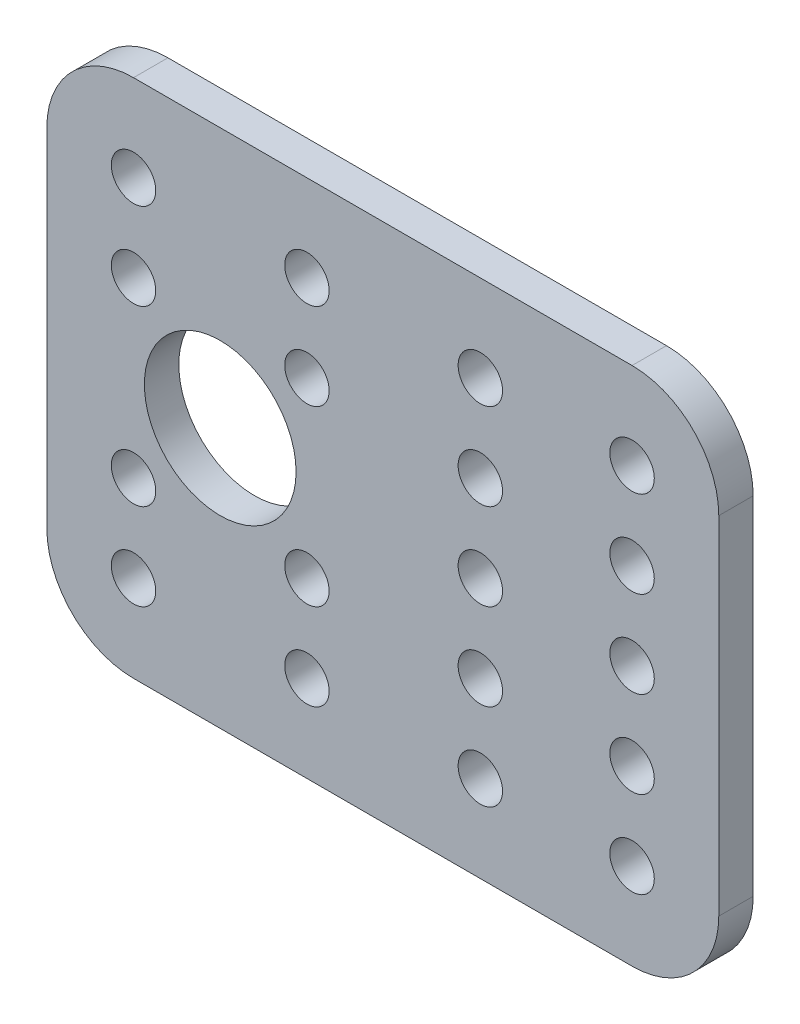
ISO-10303-21;
HEADER;
FILE_DESCRIPTION(('STEP AP214'),'2;1');
FILE_NAME('part.step','',(''),(''),'','','');
FILE_SCHEMA(('AUTOMOTIVE_DESIGN { 1 0 10303 214 1 1 1 1 }'));
ENDSEC;
DATA;
#1=APPLICATION_CONTEXT('core data for automotive mechanical design processes');
#2=APPLICATION_PROTOCOL_DEFINITION('international standard','automotive_design',2000,#1);
#3=PRODUCT_CONTEXT('',#1,'mechanical');
#4=PRODUCT('Part','Part','',(#3));
#5=PRODUCT_RELATED_PRODUCT_CATEGORY('part','',(#4));
#6=PRODUCT_DEFINITION_FORMATION('','',#4);
#7=PRODUCT_DEFINITION_CONTEXT('part definition',#1,'design');
#8=PRODUCT_DEFINITION('design','',#6,#7);
#9=PRODUCT_DEFINITION_SHAPE('','',#8);
#10=(LENGTH_UNIT() NAMED_UNIT(*) SI_UNIT(.MILLI.,.METRE.));
#11=(NAMED_UNIT(*) PLANE_ANGLE_UNIT() SI_UNIT($,.RADIAN.));
#12=(NAMED_UNIT(*) SI_UNIT($,.STERADIAN.) SOLID_ANGLE_UNIT());
#13=UNCERTAINTY_MEASURE_WITH_UNIT(LENGTH_MEASURE(1.E-05),#10,'distance_accuracy_value','');
#14=(GEOMETRIC_REPRESENTATION_CONTEXT(3) GLOBAL_UNCERTAINTY_ASSIGNED_CONTEXT((#13)) GLOBAL_UNIT_ASSIGNED_CONTEXT((#10,
#11,#12)) REPRESENTATION_CONTEXT('',''));
#15=CARTESIAN_POINT('',(0.,0.,0.));
#16=DIRECTION('',(0.,0.,1.));
#17=DIRECTION('',(1.,0.,0.));
#18=AXIS2_PLACEMENT_3D('',#15,#16,#17);
#19=CARTESIAN_POINT('',(0.,0.,3.175));
#20=DIRECTION('',(0.,0.,1.));
#21=DIRECTION('',(1.,0.,0.));
#22=AXIS2_PLACEMENT_3D('',#19,#20,#21);
#23=PLANE('',#22);
#24=CARTESIAN_POINT('',(23.0000000000002,-8.00000000000001,3.175));
#25=DIRECTION('',(0.,0.,1.));
#26=DIRECTION('',(1.,0.,0.));
#27=AXIS2_PLACEMENT_3D('',#24,#25,#26);
#28=CIRCLE('',#27,2.05);
#29=CARTESIAN_POINT('',(25.0500000000002,-8.00000000000001,3.175));
#30=VERTEX_POINT('',#29);
#31=EDGE_CURVE('E273',#30,#30,#28,.T.);
#32=ORIENTED_EDGE('',*,*,#31,.F.);
#33=EDGE_LOOP('',(#32));
#34=FACE_BOUND('',#33,.T.);
#35=CARTESIAN_POINT('',(23.0000000000001,7.99999999999999,3.175));
#36=DIRECTION('',(0.,0.,1.));
#37=DIRECTION('',(1.,0.,0.));
#38=AXIS2_PLACEMENT_3D('',#35,#36,#37);
#39=CIRCLE('',#38,2.05);
#40=CARTESIAN_POINT('',(25.0500000000001,7.99999999999999,3.175));
#41=VERTEX_POINT('',#40);
#42=EDGE_CURVE('E261',#41,#41,#39,.T.);
#43=ORIENTED_EDGE('',*,*,#42,.F.);
#44=EDGE_LOOP('',(#43));
#45=FACE_BOUND('',#44,.T.);
#46=CARTESIAN_POINT('',(-22.9999999999997,-8.00000000000001,3.175));
#47=DIRECTION('',(0.,0.,1.));
#48=DIRECTION('',(1.,0.,0.));
#49=AXIS2_PLACEMENT_3D('',#46,#47,#48);
#50=CIRCLE('',#49,2.05);
#51=CARTESIAN_POINT('',(-20.9499999999997,-8.00000000000001,3.175));
#52=VERTEX_POINT('',#51);
#53=EDGE_CURVE('E249',#52,#52,#50,.T.);
#54=ORIENTED_EDGE('',*,*,#53,.F.);
#55=EDGE_LOOP('',(#54));
#56=FACE_BOUND('',#55,.T.);
#57=CARTESIAN_POINT('',(9.00000000000034,-16.,3.175));
#58=DIRECTION('',(0.,0.,1.));
#59=DIRECTION('',(1.,0.,0.));
#60=AXIS2_PLACEMENT_3D('',#57,#58,#59);
#61=CIRCLE('',#60,2.04999999999999);
#62=CARTESIAN_POINT('',(11.0500000000003,-16.,3.175));
#63=VERTEX_POINT('',#62);
#64=EDGE_CURVE('E237',#63,#63,#61,.T.);
#65=ORIENTED_EDGE('',*,*,#64,.F.);
#66=EDGE_LOOP('',(#65));
#67=FACE_BOUND('',#66,.T.);
#68=CARTESIAN_POINT('',(9.00000000000026,-8.00000000000001,3.175));
#69=DIRECTION('',(0.,0.,1.));
#70=DIRECTION('',(1.,0.,0.));
#71=AXIS2_PLACEMENT_3D('',#68,#69,#70);
#72=CIRCLE('',#71,2.04999999999999);
#73=CARTESIAN_POINT('',(11.0500000000003,-8.00000000000001,3.175));
#74=VERTEX_POINT('',#73);
#75=EDGE_CURVE('E225',#74,#74,#72,.T.);
#76=ORIENTED_EDGE('',*,*,#75,.F.);
#77=EDGE_LOOP('',(#76));
#78=FACE_BOUND('',#77,.T.);
#79=CARTESIAN_POINT('',(9.00000000000017,0.,3.175));
#80=DIRECTION('',(0.,0.,1.));
#81=DIRECTION('',(1.,0.,0.));
#82=AXIS2_PLACEMENT_3D('',#79,#80,#81);
#83=CIRCLE('',#82,2.04999999999999);
#84=CARTESIAN_POINT('',(11.0500000000002,0.,3.175));
#85=VERTEX_POINT('',#84);
#86=EDGE_CURVE('E213',#85,#85,#83,.T.);
#87=ORIENTED_EDGE('',*,*,#86,.F.);
#88=EDGE_LOOP('',(#87));
#89=FACE_BOUND('',#88,.T.);
#90=CARTESIAN_POINT('',(-6.99999999999991,7.99999999999999,3.175));
#91=DIRECTION('',(0.,0.,1.));
#92=DIRECTION('',(1.,0.,0.));
#93=AXIS2_PLACEMENT_3D('',#90,#91,#92);
#94=CIRCLE('',#93,2.05);
#95=CARTESIAN_POINT('',(-4.94999999999991,7.99999999999999,3.175));
#96=VERTEX_POINT('',#95);
#97=EDGE_CURVE('E201',#96,#96,#94,.T.);
#98=ORIENTED_EDGE('',*,*,#97,.F.);
#99=EDGE_LOOP('',(#98));
#100=FACE_BOUND('',#99,.T.);
#101=CARTESIAN_POINT('',(-6.99999999999999,16.,3.175));
#102=DIRECTION('',(0.,0.,1.));
#103=DIRECTION('',(1.,0.,0.));
#104=AXIS2_PLACEMENT_3D('',#101,#102,#103);
#105=CIRCLE('',#104,2.05);
#106=CARTESIAN_POINT('',(-4.94999999999999,16.,3.175));
#107=VERTEX_POINT('',#106);
#108=EDGE_CURVE('E189',#107,#107,#105,.T.);
#109=ORIENTED_EDGE('',*,*,#108,.F.);
#110=EDGE_LOOP('',(#109));
#111=FACE_BOUND('',#110,.T.);
#112=CARTESIAN_POINT('',(-23.,16.,3.175));
#113=DIRECTION('',(0.,0.,1.));
#114=DIRECTION('',(1.,0.,0.));
#115=AXIS2_PLACEMENT_3D('',#112,#113,#114);
#116=CIRCLE('',#115,2.05);
#117=CARTESIAN_POINT('',(-20.95,16.,3.175));
#118=VERTEX_POINT('',#117);
#119=EDGE_CURVE('E178',#118,#118,#116,.T.);
#120=ORIENTED_EDGE('',*,*,#119,.F.);
#121=EDGE_LOOP('',(#120));
#122=FACE_BOUND('',#121,.T.);
#123=DIRECTION('',(0.,1.,0.));
#124=VECTOR('',#123,1.);
#125=CARTESIAN_POINT('',(31.,-24.,3.175));
#126=LINE('',#125,#124);
#127=CARTESIAN_POINT('',(31.,-16.,3.175));
#128=VERTEX_POINT('',#127);
#129=CARTESIAN_POINT('',(31.,16.,3.175));
#130=VERTEX_POINT('',#129);
#131=EDGE_CURVE('E173',#128,#130,#126,.T.);
#132=ORIENTED_EDGE('',*,*,#131,.T.);
#133=CARTESIAN_POINT('',(23.,16.,3.175));
#134=DIRECTION('',(0.,0.,1.));
#135=DIRECTION('',(1.,0.,0.));
#136=AXIS2_PLACEMENT_3D('',#133,#134,#135);
#137=CIRCLE('',#136,8.);
#138=CARTESIAN_POINT('',(23.,24.,3.175));
#139=VERTEX_POINT('',#138);
#140=EDGE_CURVE('E150',#130,#139,#137,.T.);
#141=ORIENTED_EDGE('',*,*,#140,.T.);
#142=DIRECTION('',(-1.,0.,0.));
#143=VECTOR('',#142,1.);
#144=CARTESIAN_POINT('',(31.,24.,3.175));
#145=LINE('',#144,#143);
#146=CARTESIAN_POINT('',(-23.,24.,3.175));
#147=VERTEX_POINT('',#146);
#148=EDGE_CURVE('E121',#139,#147,#145,.T.);
#149=ORIENTED_EDGE('',*,*,#148,.T.);
#150=CARTESIAN_POINT('',(-23.,16.,3.175));
#151=DIRECTION('',(0.,0.,1.));
#152=DIRECTION('',(1.,0.,0.));
#153=AXIS2_PLACEMENT_3D('',#150,#151,#152);
#154=CIRCLE('',#153,8.);
#155=CARTESIAN_POINT('',(-31.,16.,3.175));
#156=VERTEX_POINT('',#155);
#157=EDGE_CURVE('E145',#147,#156,#154,.T.);
#158=ORIENTED_EDGE('',*,*,#157,.T.);
#159=DIRECTION('',(0.,-1.,0.));
#160=VECTOR('',#159,1.);
#161=CARTESIAN_POINT('',(-31.,-24.,3.175));
#162=LINE('',#161,#160);
#163=CARTESIAN_POINT('',(-31.,-16.,3.175));
#164=VERTEX_POINT('',#163);
#165=EDGE_CURVE('E128',#156,#164,#162,.T.);
#166=ORIENTED_EDGE('',*,*,#165,.T.);
#167=CARTESIAN_POINT('',(-23.,-16.,3.175));
#168=DIRECTION('',(0.,0.,1.));
#169=DIRECTION('',(1.,0.,0.));
#170=AXIS2_PLACEMENT_3D('',#167,#168,#169);
#171=CIRCLE('',#170,8.);
#172=CARTESIAN_POINT('',(-23.,-24.,3.175));
#173=VERTEX_POINT('',#172);
#174=EDGE_CURVE('E57',#164,#173,#171,.T.);
#175=ORIENTED_EDGE('',*,*,#174,.T.);
#176=DIRECTION('',(1.,0.,0.));
#177=VECTOR('',#176,1.);
#178=CARTESIAN_POINT('',(31.,-24.,3.175));
#179=LINE('',#178,#177);
#180=CARTESIAN_POINT('',(23.,-24.,3.175));
#181=VERTEX_POINT('',#180);
#182=EDGE_CURVE('E131',#173,#181,#179,.T.);
#183=ORIENTED_EDGE('',*,*,#182,.T.);
#184=CARTESIAN_POINT('',(23.,-16.,3.175));
#185=DIRECTION('',(0.,0.,1.));
#186=DIRECTION('',(1.,0.,0.));
#187=AXIS2_PLACEMENT_3D('',#184,#185,#186);
#188=CIRCLE('',#187,8.);
#189=EDGE_CURVE('E148',#181,#128,#188,.T.);
#190=ORIENTED_EDGE('',*,*,#189,.T.);
#191=EDGE_LOOP('',(#132,#141,#149,#158,#166,#175,#183,#190));
#192=FACE_BOUND('',#191,.T.);
#193=CARTESIAN_POINT('',(-15.,0.,3.175));
#194=DIRECTION('',(0.,0.,1.));
#195=DIRECTION('',(1.,0.,0.));
#196=AXIS2_PLACEMENT_3D('',#193,#194,#195);
#197=CIRCLE('',#196,7.);
#198=CARTESIAN_POINT('',(-7.99999999999999,0.,3.175));
#199=VERTEX_POINT('',#198);
#200=EDGE_CURVE('E166',#199,#199,#197,.T.);
#201=ORIENTED_EDGE('',*,*,#200,.F.);
#202=EDGE_LOOP('',(#201));
#203=FACE_BOUND('',#202,.T.);
#204=CARTESIAN_POINT('',(23.,16.,3.175));
#205=DIRECTION('',(0.,0.,1.));
#206=DIRECTION('',(1.,0.,0.));
#207=AXIS2_PLACEMENT_3D('',#204,#205,#206);
#208=CIRCLE('',#207,2.05);
#209=CARTESIAN_POINT('',(25.05,16.,3.175));
#210=VERTEX_POINT('',#209);
#211=EDGE_CURVE('E183',#210,#210,#208,.T.);
#212=ORIENTED_EDGE('',*,*,#211,.F.);
#213=EDGE_LOOP('',(#212));
#214=FACE_BOUND('',#213,.T.);
#215=CARTESIAN_POINT('',(9.00000000000001,16.,3.175));
#216=DIRECTION('',(0.,0.,1.));
#217=DIRECTION('',(1.,0.,0.));
#218=AXIS2_PLACEMENT_3D('',#215,#216,#217);
#219=CIRCLE('',#218,2.04999999999999);
#220=CARTESIAN_POINT('',(11.05,16.,3.175));
#221=VERTEX_POINT('',#220);
#222=EDGE_CURVE('E195',#221,#221,#219,.T.);
#223=ORIENTED_EDGE('',*,*,#222,.F.);
#224=EDGE_LOOP('',(#223));
#225=FACE_BOUND('',#224,.T.);
#226=CARTESIAN_POINT('',(9.00000000000009,7.99999999999999,3.175));
#227=DIRECTION('',(0.,0.,1.));
#228=DIRECTION('',(1.,0.,0.));
#229=AXIS2_PLACEMENT_3D('',#226,#227,#228);
#230=CIRCLE('',#229,2.04999999999999);
#231=CARTESIAN_POINT('',(11.0500000000001,7.99999999999999,3.175));
#232=VERTEX_POINT('',#231);
#233=EDGE_CURVE('E207',#232,#232,#230,.T.);
#234=ORIENTED_EDGE('',*,*,#233,.F.);
#235=EDGE_LOOP('',(#234));
#236=FACE_BOUND('',#235,.T.);
#237=CARTESIAN_POINT('',(-6.99999999999974,-8.00000000000001,3.175));
#238=DIRECTION('',(0.,0.,1.));
#239=DIRECTION('',(1.,0.,0.));
#240=AXIS2_PLACEMENT_3D('',#237,#238,#239);
#241=CIRCLE('',#240,2.04999999999999);
#242=CARTESIAN_POINT('',(-4.94999999999975,-8.00000000000001,3.175));
#243=VERTEX_POINT('',#242);
#244=EDGE_CURVE('E219',#243,#243,#241,.T.);
#245=ORIENTED_EDGE('',*,*,#244,.F.);
#246=EDGE_LOOP('',(#245));
#247=FACE_BOUND('',#246,.T.);
#248=CARTESIAN_POINT('',(-6.99999999999966,-16.,3.175));
#249=DIRECTION('',(0.,0.,1.));
#250=DIRECTION('',(1.,0.,0.));
#251=AXIS2_PLACEMENT_3D('',#248,#249,#250);
#252=CIRCLE('',#251,2.05);
#253=CARTESIAN_POINT('',(-4.94999999999966,-16.,3.175));
#254=VERTEX_POINT('',#253);
#255=EDGE_CURVE('E231',#254,#254,#252,.T.);
#256=ORIENTED_EDGE('',*,*,#255,.F.);
#257=EDGE_LOOP('',(#256));
#258=FACE_BOUND('',#257,.T.);
#259=CARTESIAN_POINT('',(-22.9999999999999,7.99999999999999,3.175));
#260=DIRECTION('',(0.,0.,1.));
#261=DIRECTION('',(1.,0.,0.));
#262=AXIS2_PLACEMENT_3D('',#259,#260,#261);
#263=CIRCLE('',#262,2.05);
#264=CARTESIAN_POINT('',(-20.9499999999999,7.99999999999999,3.175));
#265=VERTEX_POINT('',#264);
#266=EDGE_CURVE('E243',#265,#265,#263,.T.);
#267=ORIENTED_EDGE('',*,*,#266,.F.);
#268=EDGE_LOOP('',(#267));
#269=FACE_BOUND('',#268,.T.);
#270=CARTESIAN_POINT('',(-22.9999999999997,-16.,3.175));
#271=DIRECTION('',(0.,0.,1.));
#272=DIRECTION('',(1.,0.,0.));
#273=AXIS2_PLACEMENT_3D('',#270,#271,#272);
#274=CIRCLE('',#273,2.05);
#275=CARTESIAN_POINT('',(-20.9499999999997,-16.,3.175));
#276=VERTEX_POINT('',#275);
#277=EDGE_CURVE('E255',#276,#276,#274,.T.);
#278=ORIENTED_EDGE('',*,*,#277,.F.);
#279=EDGE_LOOP('',(#278));
#280=FACE_BOUND('',#279,.T.);
#281=CARTESIAN_POINT('',(23.0000000000002,0.,3.175));
#282=DIRECTION('',(0.,0.,1.));
#283=DIRECTION('',(1.,0.,0.));
#284=AXIS2_PLACEMENT_3D('',#281,#282,#283);
#285=CIRCLE('',#284,2.05);
#286=CARTESIAN_POINT('',(25.0500000000002,0.,3.175));
#287=VERTEX_POINT('',#286);
#288=EDGE_CURVE('E267',#287,#287,#285,.T.);
#289=ORIENTED_EDGE('',*,*,#288,.F.);
#290=EDGE_LOOP('',(#289));
#291=FACE_BOUND('',#290,.T.);
#292=CARTESIAN_POINT('',(23.0000000000003,-16.,3.175));
#293=DIRECTION('',(0.,0.,1.));
#294=DIRECTION('',(1.,0.,0.));
#295=AXIS2_PLACEMENT_3D('',#292,#293,#294);
#296=CIRCLE('',#295,2.05);
#297=CARTESIAN_POINT('',(25.0500000000003,-16.,3.175));
#298=VERTEX_POINT('',#297);
#299=EDGE_CURVE('E279',#298,#298,#296,.T.);
#300=ORIENTED_EDGE('',*,*,#299,.F.);
#301=EDGE_LOOP('',(#300));
#302=FACE_BOUND('',#301,.T.);
#303=ADVANCED_FACE('F35',(#34,#45,#56,#67,#78,#89,#100,#111,#122,#192,#203,#214,#225,#236,#247,
#258,#269,#280,#291,#302),#23,.T.);
#304=CARTESIAN_POINT('',(0.,0.,0.));
#305=DIRECTION('',(0.,0.,1.));
#306=DIRECTION('',(1.,0.,0.));
#307=AXIS2_PLACEMENT_3D('',#304,#305,#306);
#308=PLANE('',#307);
#309=DIRECTION('',(-1.,0.,0.));
#310=VECTOR('',#309,1.);
#311=CARTESIAN_POINT('',(31.,24.,0.));
#312=LINE('',#311,#310);
#313=CARTESIAN_POINT('',(23.,24.,0.));
#314=VERTEX_POINT('',#313);
#315=CARTESIAN_POINT('',(-23.,24.,0.));
#316=VERTEX_POINT('',#315);
#317=EDGE_CURVE('E118',#314,#316,#312,.T.);
#318=ORIENTED_EDGE('',*,*,#317,.F.);
#319=CARTESIAN_POINT('',(23.,16.,0.));
#320=DIRECTION('',(0.,0.,1.));
#321=DIRECTION('',(1.,0.,0.));
#322=AXIS2_PLACEMENT_3D('',#319,#320,#321);
#323=CIRCLE('',#322,8.);
#324=CARTESIAN_POINT('',(31.,16.,0.));
#325=VERTEX_POINT('',#324);
#326=EDGE_CURVE('E101',#314,#325,#323,.F.);
#327=ORIENTED_EDGE('',*,*,#326,.T.);
#328=DIRECTION('',(0.,1.,0.));
#329=VECTOR('',#328,1.);
#330=CARTESIAN_POINT('',(31.,-24.,0.));
#331=LINE('',#330,#329);
#332=CARTESIAN_POINT('',(31.,-16.,0.));
#333=VERTEX_POINT('',#332);
#334=EDGE_CURVE('E129',#333,#325,#331,.T.);
#335=ORIENTED_EDGE('',*,*,#334,.F.);
#336=CARTESIAN_POINT('',(23.,-16.,0.));
#337=DIRECTION('',(0.,0.,1.));
#338=DIRECTION('',(1.,0.,0.));
#339=AXIS2_PLACEMENT_3D('',#336,#337,#338);
#340=CIRCLE('',#339,8.);
#341=CARTESIAN_POINT('',(23.,-24.,0.));
#342=VERTEX_POINT('',#341);
#343=EDGE_CURVE('E112',#333,#342,#340,.F.);
#344=ORIENTED_EDGE('',*,*,#343,.T.);
#345=DIRECTION('',(1.,0.,0.));
#346=VECTOR('',#345,1.);
#347=CARTESIAN_POINT('',(31.,-24.,0.));
#348=LINE('',#347,#346);
#349=CARTESIAN_POINT('',(-23.,-24.,0.));
#350=VERTEX_POINT('',#349);
#351=EDGE_CURVE('E133',#350,#342,#348,.T.);
#352=ORIENTED_EDGE('',*,*,#351,.F.);
#353=CARTESIAN_POINT('',(-23.,-16.,0.));
#354=DIRECTION('',(0.,0.,1.));
#355=DIRECTION('',(1.,0.,0.));
#356=AXIS2_PLACEMENT_3D('',#353,#354,#355);
#357=CIRCLE('',#356,8.);
#358=CARTESIAN_POINT('',(-31.,-16.,0.));
#359=VERTEX_POINT('',#358);
#360=EDGE_CURVE('E139',#350,#359,#357,.F.);
#361=ORIENTED_EDGE('',*,*,#360,.T.);
#362=DIRECTION('',(0.,-1.,0.));
#363=VECTOR('',#362,1.);
#364=CARTESIAN_POINT('',(-31.,-24.,0.));
#365=LINE('',#364,#363);
#366=CARTESIAN_POINT('',(-31.,16.,0.));
#367=VERTEX_POINT('',#366);
#368=EDGE_CURVE('E161',#367,#359,#365,.T.);
#369=ORIENTED_EDGE('',*,*,#368,.F.);
#370=CARTESIAN_POINT('',(-23.,16.,0.));
#371=DIRECTION('',(0.,0.,1.));
#372=DIRECTION('',(1.,0.,0.));
#373=AXIS2_PLACEMENT_3D('',#370,#371,#372);
#374=CIRCLE('',#373,8.);
#375=EDGE_CURVE('E122',#367,#316,#374,.F.);
#376=ORIENTED_EDGE('',*,*,#375,.T.);
#377=EDGE_LOOP('',(#318,#327,#335,#344,#352,#361,#369,#376));
#378=FACE_BOUND('',#377,.T.);
#379=CARTESIAN_POINT('',(-15.,0.,0.));
#380=DIRECTION('',(0.,0.,1.));
#381=DIRECTION('',(1.,0.,0.));
#382=AXIS2_PLACEMENT_3D('',#379,#380,#381);
#383=CIRCLE('',#382,7.);
#384=CARTESIAN_POINT('',(-7.99999999999999,0.,0.));
#385=VERTEX_POINT('',#384);
#386=EDGE_CURVE('E169',#385,#385,#383,.T.);
#387=ORIENTED_EDGE('',*,*,#386,.T.);
#388=EDGE_LOOP('',(#387));
#389=FACE_BOUND('',#388,.T.);
#390=CARTESIAN_POINT('',(-23.,16.,0.));
#391=DIRECTION('',(0.,0.,1.));
#392=DIRECTION('',(1.,0.,0.));
#393=AXIS2_PLACEMENT_3D('',#390,#391,#392);
#394=CIRCLE('',#393,2.05);
#395=CARTESIAN_POINT('',(-20.95,16.,0.));
#396=VERTEX_POINT('',#395);
#397=EDGE_CURVE('E180',#396,#396,#394,.T.);
#398=ORIENTED_EDGE('',*,*,#397,.T.);
#399=EDGE_LOOP('',(#398));
#400=FACE_BOUND('',#399,.T.);
#401=CARTESIAN_POINT('',(23.,16.,0.));
#402=DIRECTION('',(0.,0.,1.));
#403=DIRECTION('',(1.,0.,0.));
#404=AXIS2_PLACEMENT_3D('',#401,#402,#403);
#405=CIRCLE('',#404,2.05);
#406=CARTESIAN_POINT('',(25.05,16.,0.));
#407=VERTEX_POINT('',#406);
#408=EDGE_CURVE('E186',#407,#407,#405,.T.);
#409=ORIENTED_EDGE('',*,*,#408,.T.);
#410=EDGE_LOOP('',(#409));
#411=FACE_BOUND('',#410,.T.);
#412=CARTESIAN_POINT('',(-6.99999999999999,16.,0.));
#413=DIRECTION('',(0.,0.,1.));
#414=DIRECTION('',(1.,0.,0.));
#415=AXIS2_PLACEMENT_3D('',#412,#413,#414);
#416=CIRCLE('',#415,2.05);
#417=CARTESIAN_POINT('',(-4.94999999999999,16.,0.));
#418=VERTEX_POINT('',#417);
#419=EDGE_CURVE('E192',#418,#418,#416,.T.);
#420=ORIENTED_EDGE('',*,*,#419,.T.);
#421=EDGE_LOOP('',(#420));
#422=FACE_BOUND('',#421,.T.);
#423=CARTESIAN_POINT('',(9.00000000000001,16.,0.));
#424=DIRECTION('',(0.,0.,1.));
#425=DIRECTION('',(1.,0.,0.));
#426=AXIS2_PLACEMENT_3D('',#423,#424,#425);
#427=CIRCLE('',#426,2.04999999999999);
#428=CARTESIAN_POINT('',(11.05,16.,0.));
#429=VERTEX_POINT('',#428);
#430=EDGE_CURVE('E198',#429,#429,#427,.T.);
#431=ORIENTED_EDGE('',*,*,#430,.T.);
#432=EDGE_LOOP('',(#431));
#433=FACE_BOUND('',#432,.T.);
#434=CARTESIAN_POINT('',(-6.99999999999991,7.99999999999999,0.));
#435=DIRECTION('',(0.,0.,1.));
#436=DIRECTION('',(1.,0.,0.));
#437=AXIS2_PLACEMENT_3D('',#434,#435,#436);
#438=CIRCLE('',#437,2.05);
#439=CARTESIAN_POINT('',(-4.94999999999991,7.99999999999999,0.));
#440=VERTEX_POINT('',#439);
#441=EDGE_CURVE('E204',#440,#440,#438,.T.);
#442=ORIENTED_EDGE('',*,*,#441,.T.);
#443=EDGE_LOOP('',(#442));
#444=FACE_BOUND('',#443,.T.);
#445=CARTESIAN_POINT('',(9.00000000000009,7.99999999999999,0.));
#446=DIRECTION('',(0.,0.,1.));
#447=DIRECTION('',(1.,0.,0.));
#448=AXIS2_PLACEMENT_3D('',#445,#446,#447);
#449=CIRCLE('',#448,2.04999999999999);
#450=CARTESIAN_POINT('',(11.0500000000001,7.99999999999999,0.));
#451=VERTEX_POINT('',#450);
#452=EDGE_CURVE('E210',#451,#451,#449,.T.);
#453=ORIENTED_EDGE('',*,*,#452,.T.);
#454=EDGE_LOOP('',(#453));
#455=FACE_BOUND('',#454,.T.);
#456=CARTESIAN_POINT('',(9.00000000000017,0.,0.));
#457=DIRECTION('',(0.,0.,1.));
#458=DIRECTION('',(1.,0.,0.));
#459=AXIS2_PLACEMENT_3D('',#456,#457,#458);
#460=CIRCLE('',#459,2.04999999999999);
#461=CARTESIAN_POINT('',(11.0500000000002,0.,0.));
#462=VERTEX_POINT('',#461);
#463=EDGE_CURVE('E216',#462,#462,#460,.T.);
#464=ORIENTED_EDGE('',*,*,#463,.T.);
#465=EDGE_LOOP('',(#464));
#466=FACE_BOUND('',#465,.T.);
#467=CARTESIAN_POINT('',(-6.99999999999974,-8.00000000000001,0.));
#468=DIRECTION('',(0.,0.,1.));
#469=DIRECTION('',(1.,0.,0.));
#470=AXIS2_PLACEMENT_3D('',#467,#468,#469);
#471=CIRCLE('',#470,2.04999999999999);
#472=CARTESIAN_POINT('',(-4.94999999999975,-8.00000000000001,0.));
#473=VERTEX_POINT('',#472);
#474=EDGE_CURVE('E222',#473,#473,#471,.T.);
#475=ORIENTED_EDGE('',*,*,#474,.T.);
#476=EDGE_LOOP('',(#475));
#477=FACE_BOUND('',#476,.T.);
#478=CARTESIAN_POINT('',(9.00000000000026,-8.00000000000001,0.));
#479=DIRECTION('',(0.,0.,1.));
#480=DIRECTION('',(1.,0.,0.));
#481=AXIS2_PLACEMENT_3D('',#478,#479,#480);
#482=CIRCLE('',#481,2.04999999999999);
#483=CARTESIAN_POINT('',(11.0500000000003,-8.00000000000001,0.));
#484=VERTEX_POINT('',#483);
#485=EDGE_CURVE('E228',#484,#484,#482,.T.);
#486=ORIENTED_EDGE('',*,*,#485,.T.);
#487=EDGE_LOOP('',(#486));
#488=FACE_BOUND('',#487,.T.);
#489=CARTESIAN_POINT('',(-6.99999999999966,-16.,0.));
#490=DIRECTION('',(0.,0.,1.));
#491=DIRECTION('',(1.,0.,0.));
#492=AXIS2_PLACEMENT_3D('',#489,#490,#491);
#493=CIRCLE('',#492,2.05);
#494=CARTESIAN_POINT('',(-4.94999999999966,-16.,0.));
#495=VERTEX_POINT('',#494);
#496=EDGE_CURVE('E234',#495,#495,#493,.T.);
#497=ORIENTED_EDGE('',*,*,#496,.T.);
#498=EDGE_LOOP('',(#497));
#499=FACE_BOUND('',#498,.T.);
#500=CARTESIAN_POINT('',(9.00000000000034,-16.,0.));
#501=DIRECTION('',(0.,0.,1.));
#502=DIRECTION('',(1.,0.,0.));
#503=AXIS2_PLACEMENT_3D('',#500,#501,#502);
#504=CIRCLE('',#503,2.04999999999999);
#505=CARTESIAN_POINT('',(11.0500000000003,-16.,0.));
#506=VERTEX_POINT('',#505);
#507=EDGE_CURVE('E240',#506,#506,#504,.T.);
#508=ORIENTED_EDGE('',*,*,#507,.T.);
#509=EDGE_LOOP('',(#508));
#510=FACE_BOUND('',#509,.T.);
#511=CARTESIAN_POINT('',(-22.9999999999999,7.99999999999999,0.));
#512=DIRECTION('',(0.,0.,1.));
#513=DIRECTION('',(1.,0.,0.));
#514=AXIS2_PLACEMENT_3D('',#511,#512,#513);
#515=CIRCLE('',#514,2.05);
#516=CARTESIAN_POINT('',(-20.9499999999999,7.99999999999999,0.));
#517=VERTEX_POINT('',#516);
#518=EDGE_CURVE('E246',#517,#517,#515,.T.);
#519=ORIENTED_EDGE('',*,*,#518,.T.);
#520=EDGE_LOOP('',(#519));
#521=FACE_BOUND('',#520,.T.);
#522=CARTESIAN_POINT('',(-22.9999999999997,-8.00000000000001,0.));
#523=DIRECTION('',(0.,0.,1.));
#524=DIRECTION('',(1.,0.,0.));
#525=AXIS2_PLACEMENT_3D('',#522,#523,#524);
#526=CIRCLE('',#525,2.05);
#527=CARTESIAN_POINT('',(-20.9499999999997,-8.00000000000001,0.));
#528=VERTEX_POINT('',#527);
#529=EDGE_CURVE('E252',#528,#528,#526,.T.);
#530=ORIENTED_EDGE('',*,*,#529,.T.);
#531=EDGE_LOOP('',(#530));
#532=FACE_BOUND('',#531,.T.);
#533=CARTESIAN_POINT('',(-22.9999999999997,-16.,0.));
#534=DIRECTION('',(0.,0.,1.));
#535=DIRECTION('',(1.,0.,0.));
#536=AXIS2_PLACEMENT_3D('',#533,#534,#535);
#537=CIRCLE('',#536,2.05);
#538=CARTESIAN_POINT('',(-20.9499999999997,-16.,0.));
#539=VERTEX_POINT('',#538);
#540=EDGE_CURVE('E258',#539,#539,#537,.T.);
#541=ORIENTED_EDGE('',*,*,#540,.T.);
#542=EDGE_LOOP('',(#541));
#543=FACE_BOUND('',#542,.T.);
#544=CARTESIAN_POINT('',(23.0000000000001,7.99999999999999,0.));
#545=DIRECTION('',(0.,0.,1.));
#546=DIRECTION('',(1.,0.,0.));
#547=AXIS2_PLACEMENT_3D('',#544,#545,#546);
#548=CIRCLE('',#547,2.05);
#549=CARTESIAN_POINT('',(25.0500000000001,7.99999999999999,0.));
#550=VERTEX_POINT('',#549);
#551=EDGE_CURVE('E264',#550,#550,#548,.T.);
#552=ORIENTED_EDGE('',*,*,#551,.T.);
#553=EDGE_LOOP('',(#552));
#554=FACE_BOUND('',#553,.T.);
#555=CARTESIAN_POINT('',(23.0000000000002,0.,0.));
#556=DIRECTION('',(0.,0.,1.));
#557=DIRECTION('',(1.,0.,0.));
#558=AXIS2_PLACEMENT_3D('',#555,#556,#557);
#559=CIRCLE('',#558,2.05);
#560=CARTESIAN_POINT('',(25.0500000000002,0.,0.));
#561=VERTEX_POINT('',#560);
#562=EDGE_CURVE('E270',#561,#561,#559,.T.);
#563=ORIENTED_EDGE('',*,*,#562,.T.);
#564=EDGE_LOOP('',(#563));
#565=FACE_BOUND('',#564,.T.);
#566=CARTESIAN_POINT('',(23.0000000000002,-8.00000000000001,0.));
#567=DIRECTION('',(0.,0.,1.));
#568=DIRECTION('',(1.,0.,0.));
#569=AXIS2_PLACEMENT_3D('',#566,#567,#568);
#570=CIRCLE('',#569,2.05);
#571=CARTESIAN_POINT('',(25.0500000000002,-8.00000000000001,0.));
#572=VERTEX_POINT('',#571);
#573=EDGE_CURVE('E276',#572,#572,#570,.T.);
#574=ORIENTED_EDGE('',*,*,#573,.T.);
#575=EDGE_LOOP('',(#574));
#576=FACE_BOUND('',#575,.T.);
#577=CARTESIAN_POINT('',(23.0000000000003,-16.,0.));
#578=DIRECTION('',(0.,0.,1.));
#579=DIRECTION('',(1.,0.,0.));
#580=AXIS2_PLACEMENT_3D('',#577,#578,#579);
#581=CIRCLE('',#580,2.05);
#582=CARTESIAN_POINT('',(25.0500000000003,-16.,0.));
#583=VERTEX_POINT('',#582);
#584=EDGE_CURVE('E282',#583,#583,#581,.T.);
#585=ORIENTED_EDGE('',*,*,#584,.T.);
#586=EDGE_LOOP('',(#585));
#587=FACE_BOUND('',#586,.T.);
#588=ADVANCED_FACE('F125',(#378,#389,#400,#411,#422,#433,#444,#455,#466,#477,#488,#499,#510,
#521,#532,#543,#554,#565,#576,#587),#308,.F.);
#589=CARTESIAN_POINT('',(-31.,-24.,3.175));
#590=DIRECTION('',(1.,0.,0.));
#591=DIRECTION('',(0.,1.,0.));
#592=AXIS2_PLACEMENT_3D('',#589,#590,#591);
#593=PLANE('',#592);
#594=ORIENTED_EDGE('',*,*,#368,.T.);
#595=DIRECTION('',(0.,0.,-1.));
#596=VECTOR('',#595,1.);
#597=CARTESIAN_POINT('',(-31.,-16.,3.175));
#598=LINE('',#597,#596);
#599=EDGE_CURVE('E11',#359,#164,#598,.F.);
#600=ORIENTED_EDGE('',*,*,#599,.T.);
#601=ORIENTED_EDGE('',*,*,#165,.F.);
#602=DIRECTION('',(0.,0.,-1.));
#603=VECTOR('',#602,1.);
#604=CARTESIAN_POINT('',(-31.,16.,3.175));
#605=LINE('',#604,#603);
#606=EDGE_CURVE('E43',#156,#367,#605,.T.);
#607=ORIENTED_EDGE('',*,*,#606,.T.);
#608=EDGE_LOOP('',(#594,#600,#601,#607));
#609=FACE_BOUND('',#608,.T.);
#610=ADVANCED_FACE('F160',(#609),#593,.F.);
#611=CARTESIAN_POINT('',(31.,-24.,3.175));
#612=DIRECTION('',(0.,1.,0.));
#613=DIRECTION('',(-1.,0.,0.));
#614=AXIS2_PLACEMENT_3D('',#611,#612,#613);
#615=PLANE('',#614);
#616=ORIENTED_EDGE('',*,*,#351,.T.);
#617=DIRECTION('',(0.,0.,-1.));
#618=VECTOR('',#617,1.);
#619=CARTESIAN_POINT('',(23.,-24.,3.175));
#620=LINE('',#619,#618);
#621=EDGE_CURVE('E50',#342,#181,#620,.F.);
#622=ORIENTED_EDGE('',*,*,#621,.T.);
#623=ORIENTED_EDGE('',*,*,#182,.F.);
#624=DIRECTION('',(0.,0.,-1.));
#625=VECTOR('',#624,1.);
#626=CARTESIAN_POINT('',(-23.,-24.,3.175));
#627=LINE('',#626,#625);
#628=EDGE_CURVE('E152',#173,#350,#627,.T.);
#629=ORIENTED_EDGE('',*,*,#628,.T.);
#630=EDGE_LOOP('',(#616,#622,#623,#629));
#631=FACE_BOUND('',#630,.T.);
#632=ADVANCED_FACE('F309',(#631),#615,.F.);
#633=CARTESIAN_POINT('',(31.,-24.,3.175));
#634=DIRECTION('',(-1.,0.,0.));
#635=DIRECTION('',(0.,-1.,0.));
#636=AXIS2_PLACEMENT_3D('',#633,#634,#635);
#637=PLANE('',#636);
#638=ORIENTED_EDGE('',*,*,#334,.T.);
#639=DIRECTION('',(0.,0.,-1.));
#640=VECTOR('',#639,1.);
#641=CARTESIAN_POINT('',(31.,16.,3.175));
#642=LINE('',#641,#640);
#643=EDGE_CURVE('E106',#325,#130,#642,.F.);
#644=ORIENTED_EDGE('',*,*,#643,.T.);
#645=ORIENTED_EDGE('',*,*,#131,.F.);
#646=DIRECTION('',(0.,0.,-1.));
#647=VECTOR('',#646,1.);
#648=CARTESIAN_POINT('',(31.,-16.,3.175));
#649=LINE('',#648,#647);
#650=EDGE_CURVE('E111',#128,#333,#649,.T.);
#651=ORIENTED_EDGE('',*,*,#650,.T.);
#652=EDGE_LOOP('',(#638,#644,#645,#651));
#653=FACE_BOUND('',#652,.T.);
#654=ADVANCED_FACE('F306',(#653),#637,.F.);
#655=CARTESIAN_POINT('',(31.,24.,3.175));
#656=DIRECTION('',(0.,-1.,0.));
#657=DIRECTION('',(0.,0.,-1.));
#658=AXIS2_PLACEMENT_3D('',#655,#656,#657);
#659=PLANE('',#658);
#660=ORIENTED_EDGE('',*,*,#148,.F.);
#661=DIRECTION('',(0.,0.,-1.));
#662=VECTOR('',#661,1.);
#663=CARTESIAN_POINT('',(23.,24.,3.175));
#664=LINE('',#663,#662);
#665=EDGE_CURVE('E105',#139,#314,#664,.T.);
#666=ORIENTED_EDGE('',*,*,#665,.T.);
#667=ORIENTED_EDGE('',*,*,#317,.T.);
#668=DIRECTION('',(0.,0.,-1.));
#669=VECTOR('',#668,1.);
#670=CARTESIAN_POINT('',(-23.,24.,3.175));
#671=LINE('',#670,#669);
#672=EDGE_CURVE('E123',#316,#147,#671,.F.);
#673=ORIENTED_EDGE('',*,*,#672,.T.);
#674=EDGE_LOOP('',(#660,#666,#667,#673));
#675=FACE_BOUND('',#674,.T.);
#676=ADVANCED_FACE('F117',(#675),#659,.F.);
#677=CARTESIAN_POINT('',(-15.,0.,3.175));
#678=DIRECTION('',(0.,0.,-1.));
#679=DIRECTION('',(-1.,0.,0.));
#680=AXIS2_PLACEMENT_3D('',#677,#678,#679);
#681=CYLINDRICAL_SURFACE('',#680,7.);
#682=ORIENTED_EDGE('',*,*,#200,.T.);
#683=EDGE_LOOP('',(#682));
#684=FACE_BOUND('',#683,.T.);
#685=ORIENTED_EDGE('',*,*,#386,.F.);
#686=EDGE_LOOP('',(#685));
#687=FACE_BOUND('',#686,.T.);
#688=ADVANCED_FACE('F301',(#684,#687),#681,.F.);
#689=CARTESIAN_POINT('',(-23.,16.,3.175));
#690=DIRECTION('',(0.,0.,-1.));
#691=DIRECTION('',(-1.,0.,0.));
#692=AXIS2_PLACEMENT_3D('',#689,#690,#691);
#693=CYLINDRICAL_SURFACE('',#692,2.05);
#694=ORIENTED_EDGE('',*,*,#119,.T.);
#695=EDGE_LOOP('',(#694));
#696=FACE_BOUND('',#695,.T.);
#697=ORIENTED_EDGE('',*,*,#397,.F.);
#698=EDGE_LOOP('',(#697));
#699=FACE_BOUND('',#698,.T.);
#700=ADVANCED_FACE('F422',(#696,#699),#693,.F.);
#701=CARTESIAN_POINT('',(23.,16.,3.175));
#702=DIRECTION('',(0.,0.,-1.));
#703=DIRECTION('',(-1.,0.,0.));
#704=AXIS2_PLACEMENT_3D('',#701,#702,#703);
#705=CYLINDRICAL_SURFACE('',#704,2.05);
#706=ORIENTED_EDGE('',*,*,#211,.T.);
#707=EDGE_LOOP('',(#706));
#708=FACE_BOUND('',#707,.T.);
#709=ORIENTED_EDGE('',*,*,#408,.F.);
#710=EDGE_LOOP('',(#709));
#711=FACE_BOUND('',#710,.T.);
#712=ADVANCED_FACE('F419',(#708,#711),#705,.F.);
#713=CARTESIAN_POINT('',(-6.99999999999999,16.,3.175));
#714=DIRECTION('',(0.,0.,-1.));
#715=DIRECTION('',(-1.,0.,0.));
#716=AXIS2_PLACEMENT_3D('',#713,#714,#715);
#717=CYLINDRICAL_SURFACE('',#716,2.05);
#718=ORIENTED_EDGE('',*,*,#108,.T.);
#719=EDGE_LOOP('',(#718));
#720=FACE_BOUND('',#719,.T.);
#721=ORIENTED_EDGE('',*,*,#419,.F.);
#722=EDGE_LOOP('',(#721));
#723=FACE_BOUND('',#722,.T.);
#724=ADVANCED_FACE('F415',(#720,#723),#717,.F.);
#725=CARTESIAN_POINT('',(9.00000000000001,16.,3.175));
#726=DIRECTION('',(0.,0.,-1.));
#727=DIRECTION('',(-1.,0.,0.));
#728=AXIS2_PLACEMENT_3D('',#725,#726,#727);
#729=CYLINDRICAL_SURFACE('',#728,2.04999999999999);
#730=ORIENTED_EDGE('',*,*,#222,.T.);
#731=EDGE_LOOP('',(#730));
#732=FACE_BOUND('',#731,.T.);
#733=ORIENTED_EDGE('',*,*,#430,.F.);
#734=EDGE_LOOP('',(#733));
#735=FACE_BOUND('',#734,.T.);
#736=ADVANCED_FACE('F411',(#732,#735),#729,.F.);
#737=CARTESIAN_POINT('',(-6.99999999999991,7.99999999999999,3.175));
#738=DIRECTION('',(0.,0.,-1.));
#739=DIRECTION('',(-1.,0.,0.));
#740=AXIS2_PLACEMENT_3D('',#737,#738,#739);
#741=CYLINDRICAL_SURFACE('',#740,2.05);
#742=ORIENTED_EDGE('',*,*,#97,.T.);
#743=EDGE_LOOP('',(#742));
#744=FACE_BOUND('',#743,.T.);
#745=ORIENTED_EDGE('',*,*,#441,.F.);
#746=EDGE_LOOP('',(#745));
#747=FACE_BOUND('',#746,.T.);
#748=ADVANCED_FACE('F407',(#744,#747),#741,.F.);
#749=CARTESIAN_POINT('',(9.00000000000009,7.99999999999999,3.175));
#750=DIRECTION('',(0.,0.,-1.));
#751=DIRECTION('',(-1.,0.,0.));
#752=AXIS2_PLACEMENT_3D('',#749,#750,#751);
#753=CYLINDRICAL_SURFACE('',#752,2.04999999999999);
#754=ORIENTED_EDGE('',*,*,#233,.T.);
#755=EDGE_LOOP('',(#754));
#756=FACE_BOUND('',#755,.T.);
#757=ORIENTED_EDGE('',*,*,#452,.F.);
#758=EDGE_LOOP('',(#757));
#759=FACE_BOUND('',#758,.T.);
#760=ADVANCED_FACE('F403',(#756,#759),#753,.F.);
#761=CARTESIAN_POINT('',(9.00000000000017,0.,3.175));
#762=DIRECTION('',(0.,0.,-1.));
#763=DIRECTION('',(-1.,0.,0.));
#764=AXIS2_PLACEMENT_3D('',#761,#762,#763);
#765=CYLINDRICAL_SURFACE('',#764,2.04999999999999);
#766=ORIENTED_EDGE('',*,*,#86,.T.);
#767=EDGE_LOOP('',(#766));
#768=FACE_BOUND('',#767,.T.);
#769=ORIENTED_EDGE('',*,*,#463,.F.);
#770=EDGE_LOOP('',(#769));
#771=FACE_BOUND('',#770,.T.);
#772=ADVANCED_FACE('F399',(#768,#771),#765,.F.);
#773=CARTESIAN_POINT('',(-6.99999999999974,-8.00000000000001,3.175));
#774=DIRECTION('',(0.,0.,-1.));
#775=DIRECTION('',(-1.,0.,0.));
#776=AXIS2_PLACEMENT_3D('',#773,#774,#775);
#777=CYLINDRICAL_SURFACE('',#776,2.04999999999999);
#778=ORIENTED_EDGE('',*,*,#244,.T.);
#779=EDGE_LOOP('',(#778));
#780=FACE_BOUND('',#779,.T.);
#781=ORIENTED_EDGE('',*,*,#474,.F.);
#782=EDGE_LOOP('',(#781));
#783=FACE_BOUND('',#782,.T.);
#784=ADVANCED_FACE('F395',(#780,#783),#777,.F.);
#785=CARTESIAN_POINT('',(9.00000000000026,-8.00000000000001,3.175));
#786=DIRECTION('',(0.,0.,-1.));
#787=DIRECTION('',(-1.,0.,0.));
#788=AXIS2_PLACEMENT_3D('',#785,#786,#787);
#789=CYLINDRICAL_SURFACE('',#788,2.04999999999999);
#790=ORIENTED_EDGE('',*,*,#75,.T.);
#791=EDGE_LOOP('',(#790));
#792=FACE_BOUND('',#791,.T.);
#793=ORIENTED_EDGE('',*,*,#485,.F.);
#794=EDGE_LOOP('',(#793));
#795=FACE_BOUND('',#794,.T.);
#796=ADVANCED_FACE('F391',(#792,#795),#789,.F.);
#797=CARTESIAN_POINT('',(-6.99999999999966,-16.,3.175));
#798=DIRECTION('',(0.,0.,-1.));
#799=DIRECTION('',(-1.,0.,0.));
#800=AXIS2_PLACEMENT_3D('',#797,#798,#799);
#801=CYLINDRICAL_SURFACE('',#800,2.05);
#802=ORIENTED_EDGE('',*,*,#255,.T.);
#803=EDGE_LOOP('',(#802));
#804=FACE_BOUND('',#803,.T.);
#805=ORIENTED_EDGE('',*,*,#496,.F.);
#806=EDGE_LOOP('',(#805));
#807=FACE_BOUND('',#806,.T.);
#808=ADVANCED_FACE('F387',(#804,#807),#801,.F.);
#809=CARTESIAN_POINT('',(9.00000000000034,-16.,3.175));
#810=DIRECTION('',(0.,0.,-1.));
#811=DIRECTION('',(-1.,0.,0.));
#812=AXIS2_PLACEMENT_3D('',#809,#810,#811);
#813=CYLINDRICAL_SURFACE('',#812,2.04999999999999);
#814=ORIENTED_EDGE('',*,*,#64,.T.);
#815=EDGE_LOOP('',(#814));
#816=FACE_BOUND('',#815,.T.);
#817=ORIENTED_EDGE('',*,*,#507,.F.);
#818=EDGE_LOOP('',(#817));
#819=FACE_BOUND('',#818,.T.);
#820=ADVANCED_FACE('F383',(#816,#819),#813,.F.);
#821=CARTESIAN_POINT('',(-22.9999999999999,7.99999999999999,3.175));
#822=DIRECTION('',(0.,0.,-1.));
#823=DIRECTION('',(-1.,0.,0.));
#824=AXIS2_PLACEMENT_3D('',#821,#822,#823);
#825=CYLINDRICAL_SURFACE('',#824,2.05);
#826=ORIENTED_EDGE('',*,*,#266,.T.);
#827=EDGE_LOOP('',(#826));
#828=FACE_BOUND('',#827,.T.);
#829=ORIENTED_EDGE('',*,*,#518,.F.);
#830=EDGE_LOOP('',(#829));
#831=FACE_BOUND('',#830,.T.);
#832=ADVANCED_FACE('F379',(#828,#831),#825,.F.);
#833=CARTESIAN_POINT('',(-22.9999999999997,-8.00000000000001,3.175));
#834=DIRECTION('',(0.,0.,-1.));
#835=DIRECTION('',(-1.,0.,0.));
#836=AXIS2_PLACEMENT_3D('',#833,#834,#835);
#837=CYLINDRICAL_SURFACE('',#836,2.05);
#838=ORIENTED_EDGE('',*,*,#53,.T.);
#839=EDGE_LOOP('',(#838));
#840=FACE_BOUND('',#839,.T.);
#841=ORIENTED_EDGE('',*,*,#529,.F.);
#842=EDGE_LOOP('',(#841));
#843=FACE_BOUND('',#842,.T.);
#844=ADVANCED_FACE('F375',(#840,#843),#837,.F.);
#845=CARTESIAN_POINT('',(-22.9999999999997,-16.,3.175));
#846=DIRECTION('',(0.,0.,-1.));
#847=DIRECTION('',(-1.,0.,0.));
#848=AXIS2_PLACEMENT_3D('',#845,#846,#847);
#849=CYLINDRICAL_SURFACE('',#848,2.05);
#850=ORIENTED_EDGE('',*,*,#277,.T.);
#851=EDGE_LOOP('',(#850));
#852=FACE_BOUND('',#851,.T.);
#853=ORIENTED_EDGE('',*,*,#540,.F.);
#854=EDGE_LOOP('',(#853));
#855=FACE_BOUND('',#854,.T.);
#856=ADVANCED_FACE('F371',(#852,#855),#849,.F.);
#857=CARTESIAN_POINT('',(23.0000000000001,7.99999999999999,3.175));
#858=DIRECTION('',(0.,0.,-1.));
#859=DIRECTION('',(-1.,0.,0.));
#860=AXIS2_PLACEMENT_3D('',#857,#858,#859);
#861=CYLINDRICAL_SURFACE('',#860,2.05);
#862=ORIENTED_EDGE('',*,*,#42,.T.);
#863=EDGE_LOOP('',(#862));
#864=FACE_BOUND('',#863,.T.);
#865=ORIENTED_EDGE('',*,*,#551,.F.);
#866=EDGE_LOOP('',(#865));
#867=FACE_BOUND('',#866,.T.);
#868=ADVANCED_FACE('F353',(#864,#867),#861,.F.);
#869=CARTESIAN_POINT('',(23.0000000000002,0.,3.175));
#870=DIRECTION('',(0.,0.,-1.));
#871=DIRECTION('',(-1.,0.,0.));
#872=AXIS2_PLACEMENT_3D('',#869,#870,#871);
#873=CYLINDRICAL_SURFACE('',#872,2.05);
#874=ORIENTED_EDGE('',*,*,#288,.T.);
#875=EDGE_LOOP('',(#874));
#876=FACE_BOUND('',#875,.T.);
#877=ORIENTED_EDGE('',*,*,#562,.F.);
#878=EDGE_LOOP('',(#877));
#879=FACE_BOUND('',#878,.T.);
#880=ADVANCED_FACE('F349',(#876,#879),#873,.F.);
#881=CARTESIAN_POINT('',(23.0000000000002,-8.00000000000001,3.175));
#882=DIRECTION('',(0.,0.,-1.));
#883=DIRECTION('',(-1.,0.,0.));
#884=AXIS2_PLACEMENT_3D('',#881,#882,#883);
#885=CYLINDRICAL_SURFACE('',#884,2.05);
#886=ORIENTED_EDGE('',*,*,#31,.T.);
#887=EDGE_LOOP('',(#886));
#888=FACE_BOUND('',#887,.T.);
#889=ORIENTED_EDGE('',*,*,#573,.F.);
#890=EDGE_LOOP('',(#889));
#891=FACE_BOUND('',#890,.T.);
#892=ADVANCED_FACE('F352',(#888,#891),#885,.F.);
#893=CARTESIAN_POINT('',(23.0000000000003,-16.,3.175));
#894=DIRECTION('',(0.,0.,-1.));
#895=DIRECTION('',(-1.,0.,0.));
#896=AXIS2_PLACEMENT_3D('',#893,#894,#895);
#897=CYLINDRICAL_SURFACE('',#896,2.05);
#898=ORIENTED_EDGE('',*,*,#299,.T.);
#899=EDGE_LOOP('',(#898));
#900=FACE_BOUND('',#899,.T.);
#901=ORIENTED_EDGE('',*,*,#584,.F.);
#902=EDGE_LOOP('',(#901));
#903=FACE_BOUND('',#902,.T.);
#904=ADVANCED_FACE('F288',(#900,#903),#897,.F.);
#905=CARTESIAN_POINT('',(23.,16.,3.175));
#906=DIRECTION('',(0.,0.,-1.));
#907=DIRECTION('',(-1.,0.,0.));
#908=AXIS2_PLACEMENT_3D('',#905,#906,#907);
#909=CYLINDRICAL_SURFACE('',#908,8.);
#910=ORIENTED_EDGE('',*,*,#140,.F.);
#911=ORIENTED_EDGE('',*,*,#643,.F.);
#912=ORIENTED_EDGE('',*,*,#326,.F.);
#913=ORIENTED_EDGE('',*,*,#665,.F.);
#914=EDGE_LOOP('',(#910,#911,#912,#913));
#915=FACE_BOUND('',#914,.T.);
#916=ADVANCED_FACE('F104',(#915),#909,.T.);
#917=CARTESIAN_POINT('',(23.,-16.,3.175));
#918=DIRECTION('',(0.,0.,-1.));
#919=DIRECTION('',(-1.,0.,0.));
#920=AXIS2_PLACEMENT_3D('',#917,#918,#919);
#921=CYLINDRICAL_SURFACE('',#920,8.);
#922=ORIENTED_EDGE('',*,*,#189,.F.);
#923=ORIENTED_EDGE('',*,*,#621,.F.);
#924=ORIENTED_EDGE('',*,*,#343,.F.);
#925=ORIENTED_EDGE('',*,*,#650,.F.);
#926=EDGE_LOOP('',(#922,#923,#924,#925));
#927=FACE_BOUND('',#926,.T.);
#928=ADVANCED_FACE('F317',(#927),#921,.T.);
#929=CARTESIAN_POINT('',(-23.,-16.,3.175));
#930=DIRECTION('',(0.,0.,-1.));
#931=DIRECTION('',(-1.,0.,0.));
#932=AXIS2_PLACEMENT_3D('',#929,#930,#931);
#933=CYLINDRICAL_SURFACE('',#932,8.);
#934=ORIENTED_EDGE('',*,*,#174,.F.);
#935=ORIENTED_EDGE('',*,*,#599,.F.);
#936=ORIENTED_EDGE('',*,*,#360,.F.);
#937=ORIENTED_EDGE('',*,*,#628,.F.);
#938=EDGE_LOOP('',(#934,#935,#936,#937));
#939=FACE_BOUND('',#938,.T.);
#940=ADVANCED_FACE('F319',(#939),#933,.T.);
#941=CARTESIAN_POINT('',(-23.,16.,3.175));
#942=DIRECTION('',(0.,0.,-1.));
#943=DIRECTION('',(-1.,0.,0.));
#944=AXIS2_PLACEMENT_3D('',#941,#942,#943);
#945=CYLINDRICAL_SURFACE('',#944,8.);
#946=ORIENTED_EDGE('',*,*,#157,.F.);
#947=ORIENTED_EDGE('',*,*,#672,.F.);
#948=ORIENTED_EDGE('',*,*,#375,.F.);
#949=ORIENTED_EDGE('',*,*,#606,.F.);
#950=EDGE_LOOP('',(#946,#947,#948,#949));
#951=FACE_BOUND('',#950,.T.);
#952=ADVANCED_FACE('F37',(#951),#945,.T.);
#953=CLOSED_SHELL('',(#303,#588,#610,#632,#654,#676,#688,#700,#712,#724,#736,#748,#760,#772,
#784,#796,#808,#820,#832,#844,#856,#868,#880,#892,#904,#916,#928,#940,#952));
#954=MANIFOLD_SOLID_BREP('B2',#953);
#955=ADVANCED_BREP_SHAPE_REPRESENTATION('',(#18,#954),#14);
#956=SHAPE_DEFINITION_REPRESENTATION(#9,#955);
ENDSEC;
END-ISO-10303-21;
